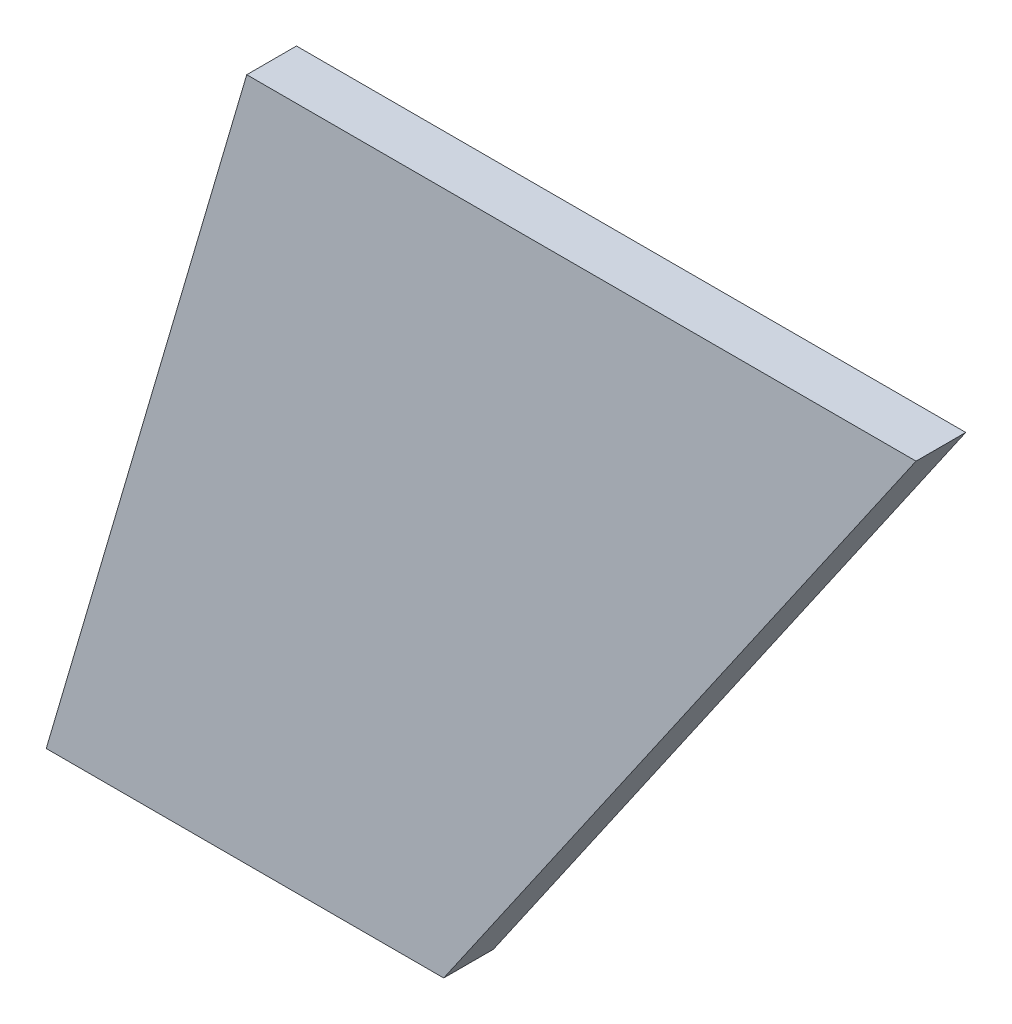
ISO-10303-21;
HEADER;
FILE_DESCRIPTION(('STEP AP214'),'2;1');
FILE_NAME('part.step','',(''),(''),'','','');
FILE_SCHEMA(('AUTOMOTIVE_DESIGN { 1 0 10303 214 1 1 1 1 }'));
ENDSEC;
DATA;
#1=APPLICATION_CONTEXT('core data for automotive mechanical design processes');
#2=APPLICATION_PROTOCOL_DEFINITION('international standard','automotive_design',2000,#1);
#3=PRODUCT_CONTEXT('',#1,'mechanical');
#4=PRODUCT('Part','Part','',(#3));
#5=PRODUCT_RELATED_PRODUCT_CATEGORY('part','',(#4));
#6=PRODUCT_DEFINITION_FORMATION('','',#4);
#7=PRODUCT_DEFINITION_CONTEXT('part definition',#1,'design');
#8=PRODUCT_DEFINITION('design','',#6,#7);
#9=PRODUCT_DEFINITION_SHAPE('','',#8);
#10=(LENGTH_UNIT() NAMED_UNIT(*) SI_UNIT(.MILLI.,.METRE.));
#11=(NAMED_UNIT(*) PLANE_ANGLE_UNIT() SI_UNIT($,.RADIAN.));
#12=(NAMED_UNIT(*) SI_UNIT($,.STERADIAN.) SOLID_ANGLE_UNIT());
#13=UNCERTAINTY_MEASURE_WITH_UNIT(LENGTH_MEASURE(1.E-05),#10,'distance_accuracy_value','');
#14=(GEOMETRIC_REPRESENTATION_CONTEXT(3) GLOBAL_UNCERTAINTY_ASSIGNED_CONTEXT((#13)) GLOBAL_UNIT_ASSIGNED_CONTEXT((#10,
#11,#12)) REPRESENTATION_CONTEXT('',''));
#15=CARTESIAN_POINT('',(0.,0.,0.));
#16=DIRECTION('',(0.,0.,1.));
#17=DIRECTION('',(1.,0.,0.));
#18=AXIS2_PLACEMENT_3D('',#15,#16,#17);
#19=CARTESIAN_POINT('',(-31.2021388133114,48.7949093628736,-9.525));
#20=DIRECTION('',(0.,-1.,0.));
#21=DIRECTION('',(1.,0.,0.));
#22=AXIS2_PLACEMENT_3D('',#19,#20,#21);
#23=PLANE('',#22);
#24=DIRECTION('',(1.,0.,0.));
#25=VECTOR('',#24,1.);
#26=CARTESIAN_POINT('',(-31.2021388133114,48.7949093628736,0.));
#27=LINE('',#26,#25);
#28=CARTESIAN_POINT('',(-107.351338813311,48.7949093628736,0.));
#29=VERTEX_POINT('',#28);
#30=CARTESIAN_POINT('',(-31.2021388133114,48.7949093628736,0.));
#31=VERTEX_POINT('',#30);
#32=EDGE_CURVE('E97',#29,#31,#27,.T.);
#33=ORIENTED_EDGE('',*,*,#32,.F.);
#34=DIRECTION('',(0.,0.,1.));
#35=VECTOR('',#34,1.);
#36=CARTESIAN_POINT('',(-107.351338813311,48.7949093628736,-9.525));
#37=LINE('',#36,#35);
#38=CARTESIAN_POINT('',(-107.351338813311,48.7949093628736,-9.525));
#39=VERTEX_POINT('',#38);
#40=EDGE_CURVE('E11',#39,#29,#37,.T.);
#41=ORIENTED_EDGE('',*,*,#40,.F.);
#42=DIRECTION('',(1.,0.,0.));
#43=VECTOR('',#42,1.);
#44=CARTESIAN_POINT('',(-31.2021388133114,48.7949093628736,-9.525));
#45=LINE('',#44,#43);
#46=CARTESIAN_POINT('',(-31.2021388133114,48.7949093628736,-9.525));
#47=VERTEX_POINT('',#46);
#48=EDGE_CURVE('E91',#39,#47,#45,.T.);
#49=ORIENTED_EDGE('',*,*,#48,.T.);
#50=DIRECTION('',(0.,0.,1.));
#51=VECTOR('',#50,1.);
#52=CARTESIAN_POINT('',(-31.2021388133114,48.7949093628736,-9.525));
#53=LINE('',#52,#51);
#54=EDGE_CURVE('E36',#47,#31,#53,.T.);
#55=ORIENTED_EDGE('',*,*,#54,.T.);
#56=EDGE_LOOP('',(#33,#41,#49,#55));
#57=FACE_BOUND('',#56,.T.);
#58=ADVANCED_FACE('F33',(#57),#23,.T.);
#59=CARTESIAN_POINT('',(-107.351338813311,48.7949093628736,-9.525));
#60=DIRECTION('',(-0.959594383694382,0.281386955600644,0.));
#61=DIRECTION('',(-0.281386955600644,-0.959594383694382,0.));
#62=AXIS2_PLACEMENT_3D('',#59,#60,#61);
#63=PLANE('',#62);
#64=DIRECTION('',(-0.281386955600644,-0.959594383694382,0.));
#65=VECTOR('',#64,1.);
#66=CARTESIAN_POINT('',(-107.351338813311,48.7949093628736,0.));
#67=LINE('',#66,#65);
#68=CARTESIAN_POINT('',(-68.9358770835593,179.800489362874,0.));
#69=VERTEX_POINT('',#68);
#70=EDGE_CURVE('E93',#69,#29,#67,.T.);
#71=ORIENTED_EDGE('',*,*,#70,.F.);
#72=DIRECTION('',(0.,0.,1.));
#73=VECTOR('',#72,1.);
#74=CARTESIAN_POINT('',(-68.9358770835593,179.800489362874,-9.525));
#75=LINE('',#74,#73);
#76=CARTESIAN_POINT('',(-68.9358770835593,179.800489362874,-9.525));
#77=VERTEX_POINT('',#76);
#78=EDGE_CURVE('E42',#77,#69,#75,.T.);
#79=ORIENTED_EDGE('',*,*,#78,.F.);
#80=DIRECTION('',(-0.281386955600644,-0.959594383694382,0.));
#81=VECTOR('',#80,1.);
#82=CARTESIAN_POINT('',(-107.351338813311,48.7949093628736,-9.525));
#83=LINE('',#82,#81);
#84=EDGE_CURVE('E88',#77,#39,#83,.T.);
#85=ORIENTED_EDGE('',*,*,#84,.T.);
#86=ORIENTED_EDGE('',*,*,#40,.T.);
#87=EDGE_LOOP('',(#71,#79,#85,#86));
#88=FACE_BOUND('',#87,.T.);
#89=ADVANCED_FACE('F107',(#88),#63,.T.);
#90=CARTESIAN_POINT('',(-68.9358770835593,179.800489362874,-9.525));
#91=DIRECTION('',(0.,1.,0.));
#92=DIRECTION('',(0.,0.,1.));
#93=AXIS2_PLACEMENT_3D('',#90,#91,#92);
#94=PLANE('',#93);
#95=DIRECTION('',(-1.,0.,0.));
#96=VECTOR('',#95,1.);
#97=CARTESIAN_POINT('',(-68.9358770835593,179.800489362874,0.));
#98=LINE('',#97,#96);
#99=CARTESIAN_POINT('',(59.2934829164407,179.800489362874,0.));
#100=VERTEX_POINT('',#99);
#101=EDGE_CURVE('E83',#100,#69,#98,.T.);
#102=ORIENTED_EDGE('',*,*,#101,.F.);
#103=DIRECTION('',(0.,0.,1.));
#104=VECTOR('',#103,1.);
#105=CARTESIAN_POINT('',(59.2934829164407,179.800489362874,-9.525));
#106=LINE('',#105,#104);
#107=CARTESIAN_POINT('',(59.2934829164407,179.800489362874,-9.525));
#108=VERTEX_POINT('',#107);
#109=EDGE_CURVE('E78',#108,#100,#106,.T.);
#110=ORIENTED_EDGE('',*,*,#109,.F.);
#111=DIRECTION('',(-1.,0.,0.));
#112=VECTOR('',#111,1.);
#113=CARTESIAN_POINT('',(-68.9358770835593,179.800489362874,-9.525));
#114=LINE('',#113,#112);
#115=EDGE_CURVE('E81',#108,#77,#114,.T.);
#116=ORIENTED_EDGE('',*,*,#115,.T.);
#117=ORIENTED_EDGE('',*,*,#78,.T.);
#118=EDGE_LOOP('',(#102,#110,#116,#117));
#119=FACE_BOUND('',#118,.T.);
#120=ADVANCED_FACE('F80',(#119),#94,.T.);
#121=CARTESIAN_POINT('',(59.2934829164407,179.800489362874,-9.525));
#122=DIRECTION('',(0.822781219824482,-0.56835821829559,0.));
#123=DIRECTION('',(0.56835821829559,0.822781219824482,0.));
#124=AXIS2_PLACEMENT_3D('',#121,#122,#123);
#125=PLANE('',#124);
#126=DIRECTION('',(0.56835821829559,0.822781219824482,0.));
#127=VECTOR('',#126,1.);
#128=CARTESIAN_POINT('',(59.2934829164407,179.800489362874,0.));
#129=LINE('',#128,#127);
#130=EDGE_CURVE('E100',#31,#100,#129,.T.);
#131=ORIENTED_EDGE('',*,*,#130,.F.);
#132=ORIENTED_EDGE('',*,*,#54,.F.);
#133=DIRECTION('',(0.56835821829559,0.822781219824482,0.));
#134=VECTOR('',#133,1.);
#135=CARTESIAN_POINT('',(59.2934829164407,179.800489362874,-9.525));
#136=LINE('',#135,#134);
#137=EDGE_CURVE('E87',#47,#108,#136,.T.);
#138=ORIENTED_EDGE('',*,*,#137,.T.);
#139=ORIENTED_EDGE('',*,*,#109,.T.);
#140=EDGE_LOOP('',(#131,#132,#138,#139));
#141=FACE_BOUND('',#140,.T.);
#142=ADVANCED_FACE('F90',(#141),#125,.T.);
#143=CARTESIAN_POINT('',(0.,0.,-9.525));
#144=DIRECTION('',(0.,0.,-1.));
#145=DIRECTION('',(-1.,0.,0.));
#146=AXIS2_PLACEMENT_3D('',#143,#144,#145);
#147=PLANE('',#146);
#148=ORIENTED_EDGE('',*,*,#48,.F.);
#149=ORIENTED_EDGE('',*,*,#84,.F.);
#150=ORIENTED_EDGE('',*,*,#115,.F.);
#151=ORIENTED_EDGE('',*,*,#137,.F.);
#152=EDGE_LOOP('',(#148,#149,#150,#151));
#153=FACE_BOUND('',#152,.T.);
#154=ADVANCED_FACE('F86',(#153),#147,.T.);
#155=CARTESIAN_POINT('',(0.,0.,0.));
#156=DIRECTION('',(0.,0.,-1.));
#157=DIRECTION('',(-1.,0.,0.));
#158=AXIS2_PLACEMENT_3D('',#155,#156,#157);
#159=PLANE('',#158);
#160=ORIENTED_EDGE('',*,*,#32,.T.);
#161=ORIENTED_EDGE('',*,*,#130,.T.);
#162=ORIENTED_EDGE('',*,*,#101,.T.);
#163=ORIENTED_EDGE('',*,*,#70,.T.);
#164=EDGE_LOOP('',(#160,#161,#162,#163));
#165=FACE_BOUND('',#164,.T.);
#166=ADVANCED_FACE('F106',(#165),#159,.F.);
#167=CLOSED_SHELL('',(#58,#89,#120,#142,#154,#166));
#168=MANIFOLD_SOLID_BREP('B2',#167);
#169=ADVANCED_BREP_SHAPE_REPRESENTATION('',(#18,#168),#14);
#170=SHAPE_DEFINITION_REPRESENTATION(#9,#169);
ENDSEC;
END-ISO-10303-21;
